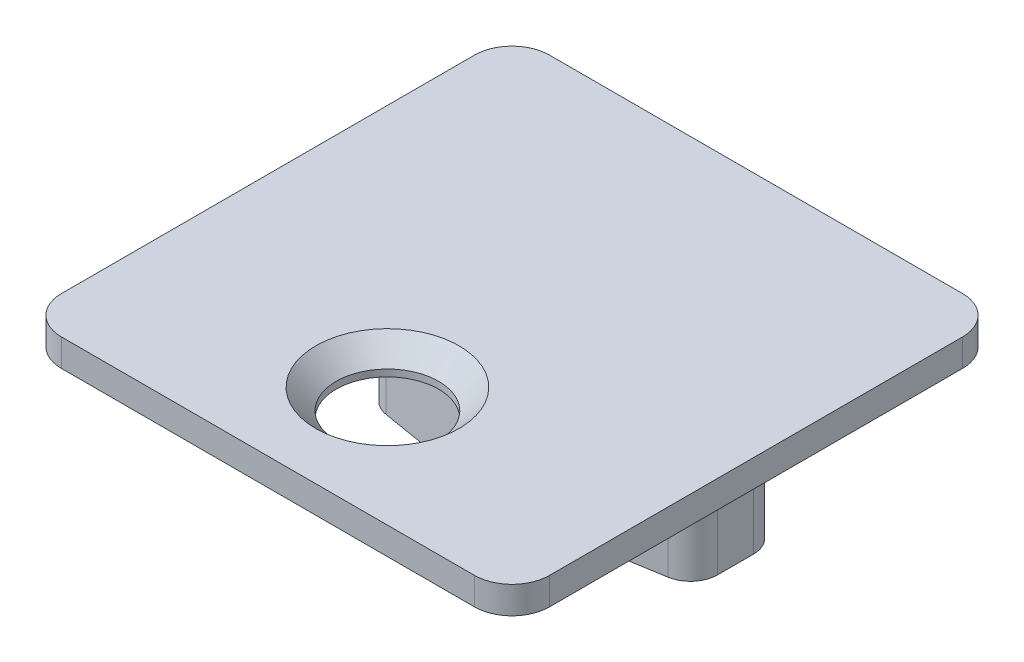
ISO-10303-21;
HEADER;
FILE_DESCRIPTION(('STEP AP214'),'2;1');
FILE_NAME('part.step','',(''),(''),'','','');
FILE_SCHEMA(('AUTOMOTIVE_DESIGN { 1 0 10303 214 1 1 1 1 }'));
ENDSEC;
DATA;
#1=APPLICATION_CONTEXT('core data for automotive mechanical design processes');
#2=APPLICATION_PROTOCOL_DEFINITION('international standard','automotive_design',2000,#1);
#3=PRODUCT_CONTEXT('',#1,'mechanical');
#4=PRODUCT('Part','Part','',(#3));
#5=PRODUCT_RELATED_PRODUCT_CATEGORY('part','',(#4));
#6=PRODUCT_DEFINITION_FORMATION('','',#4);
#7=PRODUCT_DEFINITION_CONTEXT('part definition',#1,'design');
#8=PRODUCT_DEFINITION('design','',#6,#7);
#9=PRODUCT_DEFINITION_SHAPE('','',#8);
#10=(LENGTH_UNIT() NAMED_UNIT(*) SI_UNIT(.MILLI.,.METRE.));
#11=(NAMED_UNIT(*) PLANE_ANGLE_UNIT() SI_UNIT($,.RADIAN.));
#12=(NAMED_UNIT(*) SI_UNIT($,.STERADIAN.) SOLID_ANGLE_UNIT());
#13=UNCERTAINTY_MEASURE_WITH_UNIT(LENGTH_MEASURE(1.E-05),#10,'distance_accuracy_value','');
#14=(GEOMETRIC_REPRESENTATION_CONTEXT(3) GLOBAL_UNCERTAINTY_ASSIGNED_CONTEXT((#13)) GLOBAL_UNIT_ASSIGNED_CONTEXT((#10,
#11,#12)) REPRESENTATION_CONTEXT('',''));
#15=CARTESIAN_POINT('',(0.,0.,0.));
#16=DIRECTION('',(0.,0.,1.));
#17=DIRECTION('',(1.,0.,0.));
#18=AXIS2_PLACEMENT_3D('',#15,#16,#17);
#19=CARTESIAN_POINT('',(0.,2.,-17.875));
#20=DIRECTION('',(0.,0.,-1.));
#21=DIRECTION('',(-1.,0.,0.));
#22=AXIS2_PLACEMENT_3D('',#19,#20,#21);
#23=PLANE('',#22);
#24=DIRECTION('',(1.,0.,0.));
#25=VECTOR('',#24,1.);
#26=CARTESIAN_POINT('',(0.,0.,-17.875));
#27=LINE('',#26,#25);
#28=CARTESIAN_POINT('',(-15.125,0.,-17.875));
#29=VERTEX_POINT('',#28);
#30=CARTESIAN_POINT('',(15.125,0.,-17.875));
#31=VERTEX_POINT('',#30);
#32=EDGE_CURVE('E280',#29,#31,#27,.T.);
#33=ORIENTED_EDGE('',*,*,#32,.F.);
#34=DIRECTION('',(0.,-1.,0.));
#35=VECTOR('',#34,1.);
#36=CARTESIAN_POINT('',(-15.125,2.,-17.875));
#37=LINE('',#36,#35);
#38=CARTESIAN_POINT('',(-15.125,2.,-17.875));
#39=VERTEX_POINT('',#38);
#40=EDGE_CURVE('E348',#39,#29,#37,.T.);
#41=ORIENTED_EDGE('',*,*,#40,.F.);
#42=DIRECTION('',(1.,0.,0.));
#43=VECTOR('',#42,1.);
#44=CARTESIAN_POINT('',(0.,2.,-17.875));
#45=LINE('',#44,#43);
#46=CARTESIAN_POINT('',(15.125,2.,-17.875));
#47=VERTEX_POINT('',#46);
#48=EDGE_CURVE('E289',#39,#47,#45,.T.);
#49=ORIENTED_EDGE('',*,*,#48,.T.);
#50=DIRECTION('',(0.,-1.,0.));
#51=VECTOR('',#50,1.);
#52=CARTESIAN_POINT('',(15.125,2.,-17.875));
#53=LINE('',#52,#51);
#54=EDGE_CURVE('E309',#47,#31,#53,.T.);
#55=ORIENTED_EDGE('',*,*,#54,.T.);
#56=EDGE_LOOP('',(#33,#41,#49,#55));
#57=FACE_BOUND('',#56,.T.);
#58=ADVANCED_FACE('F35',(#57),#23,.T.);
#59=CARTESIAN_POINT('',(-15.125,2.,-15.125));
#60=DIRECTION('',(0.,-1.,0.));
#61=DIRECTION('',(0.,0.,-1.));
#62=AXIS2_PLACEMENT_3D('',#59,#60,#61);
#63=CYLINDRICAL_SURFACE('',#62,2.75);
#64=CARTESIAN_POINT('',(-15.125,0.,-15.125));
#65=DIRECTION('',(0.,1.,0.));
#66=DIRECTION('',(0.,0.,1.));
#67=AXIS2_PLACEMENT_3D('',#64,#65,#66);
#68=CIRCLE('',#67,2.75);
#69=CARTESIAN_POINT('',(-17.875,0.,-15.125));
#70=VERTEX_POINT('',#69);
#71=EDGE_CURVE('E312',#29,#70,#68,.T.);
#72=ORIENTED_EDGE('',*,*,#71,.T.);
#73=DIRECTION('',(0.,-1.,0.));
#74=VECTOR('',#73,1.);
#75=CARTESIAN_POINT('',(-17.875,2.,-15.125));
#76=LINE('',#75,#74);
#77=CARTESIAN_POINT('',(-17.875,2.,-15.125));
#78=VERTEX_POINT('',#77);
#79=EDGE_CURVE('E345',#78,#70,#76,.T.);
#80=ORIENTED_EDGE('',*,*,#79,.F.);
#81=CARTESIAN_POINT('',(-15.125,2.,-15.125));
#82=DIRECTION('',(0.,1.,0.));
#83=DIRECTION('',(0.,0.,1.));
#84=AXIS2_PLACEMENT_3D('',#81,#82,#83);
#85=CIRCLE('',#84,2.75);
#86=EDGE_CURVE('E292',#39,#78,#85,.T.);
#87=ORIENTED_EDGE('',*,*,#86,.F.);
#88=ORIENTED_EDGE('',*,*,#40,.T.);
#89=EDGE_LOOP('',(#72,#80,#87,#88));
#90=FACE_BOUND('',#89,.T.);
#91=ADVANCED_FACE('F416',(#90),#63,.T.);
#92=CARTESIAN_POINT('',(-17.875,2.,0.));
#93=DIRECTION('',(1.,0.,0.));
#94=DIRECTION('',(0.,0.,-1.));
#95=AXIS2_PLACEMENT_3D('',#92,#93,#94);
#96=PLANE('',#95);
#97=DIRECTION('',(0.,0.,1.));
#98=VECTOR('',#97,1.);
#99=CARTESIAN_POINT('',(-17.875,0.,0.));
#100=LINE('',#99,#98);
#101=CARTESIAN_POINT('',(-17.875,0.,15.125));
#102=VERTEX_POINT('',#101);
#103=EDGE_CURVE('E314',#70,#102,#100,.T.);
#104=ORIENTED_EDGE('',*,*,#103,.T.);
#105=DIRECTION('',(0.,-1.,0.));
#106=VECTOR('',#105,1.);
#107=CARTESIAN_POINT('',(-17.875,2.,15.125));
#108=LINE('',#107,#106);
#109=CARTESIAN_POINT('',(-17.875,2.,15.125));
#110=VERTEX_POINT('',#109);
#111=EDGE_CURVE('E342',#110,#102,#108,.T.);
#112=ORIENTED_EDGE('',*,*,#111,.F.);
#113=DIRECTION('',(0.,0.,1.));
#114=VECTOR('',#113,1.);
#115=CARTESIAN_POINT('',(-17.875,2.,0.));
#116=LINE('',#115,#114);
#117=EDGE_CURVE('E295',#78,#110,#116,.T.);
#118=ORIENTED_EDGE('',*,*,#117,.F.);
#119=ORIENTED_EDGE('',*,*,#79,.T.);
#120=EDGE_LOOP('',(#104,#112,#118,#119));
#121=FACE_BOUND('',#120,.T.);
#122=ADVANCED_FACE('F422',(#121),#96,.F.);
#123=CARTESIAN_POINT('',(-15.125,2.,15.125));
#124=DIRECTION('',(0.,-1.,0.));
#125=DIRECTION('',(0.,0.,-1.));
#126=AXIS2_PLACEMENT_3D('',#123,#124,#125);
#127=CYLINDRICAL_SURFACE('',#126,2.75);
#128=CARTESIAN_POINT('',(-15.125,0.,15.125));
#129=DIRECTION('',(0.,1.,0.));
#130=DIRECTION('',(0.,0.,1.));
#131=AXIS2_PLACEMENT_3D('',#128,#129,#130);
#132=CIRCLE('',#131,2.75);
#133=CARTESIAN_POINT('',(-15.125,0.,17.875));
#134=VERTEX_POINT('',#133);
#135=EDGE_CURVE('E316',#102,#134,#132,.T.);
#136=ORIENTED_EDGE('',*,*,#135,.T.);
#137=DIRECTION('',(0.,-1.,0.));
#138=VECTOR('',#137,1.);
#139=CARTESIAN_POINT('',(-15.125,2.,17.875));
#140=LINE('',#139,#138);
#141=CARTESIAN_POINT('',(-15.125,2.,17.875));
#142=VERTEX_POINT('',#141);
#143=EDGE_CURVE('E339',#142,#134,#140,.T.);
#144=ORIENTED_EDGE('',*,*,#143,.F.);
#145=CARTESIAN_POINT('',(-15.125,2.,15.125));
#146=DIRECTION('',(0.,1.,0.));
#147=DIRECTION('',(0.,0.,1.));
#148=AXIS2_PLACEMENT_3D('',#145,#146,#147);
#149=CIRCLE('',#148,2.75);
#150=EDGE_CURVE('E297',#110,#142,#149,.T.);
#151=ORIENTED_EDGE('',*,*,#150,.F.);
#152=ORIENTED_EDGE('',*,*,#111,.T.);
#153=EDGE_LOOP('',(#136,#144,#151,#152));
#154=FACE_BOUND('',#153,.T.);
#155=ADVANCED_FACE('F544',(#154),#127,.T.);
#156=CARTESIAN_POINT('',(0.,2.,17.875));
#157=DIRECTION('',(0.,0.,-1.));
#158=DIRECTION('',(-1.,0.,0.));
#159=AXIS2_PLACEMENT_3D('',#156,#157,#158);
#160=PLANE('',#159);
#161=DIRECTION('',(1.,0.,0.));
#162=VECTOR('',#161,1.);
#163=CARTESIAN_POINT('',(0.,0.,17.875));
#164=LINE('',#163,#162);
#165=CARTESIAN_POINT('',(15.125,0.,17.875));
#166=VERTEX_POINT('',#165);
#167=EDGE_CURVE('E318',#134,#166,#164,.T.);
#168=ORIENTED_EDGE('',*,*,#167,.T.);
#169=DIRECTION('',(0.,-1.,0.));
#170=VECTOR('',#169,1.);
#171=CARTESIAN_POINT('',(15.125,2.,17.875));
#172=LINE('',#171,#170);
#173=CARTESIAN_POINT('',(15.125,2.,17.875));
#174=VERTEX_POINT('',#173);
#175=EDGE_CURVE('E336',#174,#166,#172,.T.);
#176=ORIENTED_EDGE('',*,*,#175,.F.);
#177=DIRECTION('',(1.,0.,0.));
#178=VECTOR('',#177,1.);
#179=CARTESIAN_POINT('',(0.,2.,17.875));
#180=LINE('',#179,#178);
#181=EDGE_CURVE('E299',#142,#174,#180,.T.);
#182=ORIENTED_EDGE('',*,*,#181,.F.);
#183=ORIENTED_EDGE('',*,*,#143,.T.);
#184=EDGE_LOOP('',(#168,#176,#182,#183));
#185=FACE_BOUND('',#184,.T.);
#186=ADVANCED_FACE('F540',(#185),#160,.F.);
#187=CARTESIAN_POINT('',(15.125,2.,15.125));
#188=DIRECTION('',(0.,-1.,0.));
#189=DIRECTION('',(0.,0.,-1.));
#190=AXIS2_PLACEMENT_3D('',#187,#188,#189);
#191=CYLINDRICAL_SURFACE('',#190,2.75);
#192=CARTESIAN_POINT('',(15.125,0.,15.125));
#193=DIRECTION('',(0.,1.,0.));
#194=DIRECTION('',(0.,0.,1.));
#195=AXIS2_PLACEMENT_3D('',#192,#193,#194);
#196=CIRCLE('',#195,2.75);
#197=CARTESIAN_POINT('',(17.875,0.,15.125));
#198=VERTEX_POINT('',#197);
#199=EDGE_CURVE('E320',#166,#198,#196,.T.);
#200=ORIENTED_EDGE('',*,*,#199,.T.);
#201=DIRECTION('',(0.,-1.,0.));
#202=VECTOR('',#201,1.);
#203=CARTESIAN_POINT('',(17.875,2.,15.125));
#204=LINE('',#203,#202);
#205=CARTESIAN_POINT('',(17.875,2.,15.125));
#206=VERTEX_POINT('',#205);
#207=EDGE_CURVE('E334',#206,#198,#204,.T.);
#208=ORIENTED_EDGE('',*,*,#207,.F.);
#209=CARTESIAN_POINT('',(15.125,2.,15.125));
#210=DIRECTION('',(0.,1.,0.));
#211=DIRECTION('',(0.,0.,1.));
#212=AXIS2_PLACEMENT_3D('',#209,#210,#211);
#213=CIRCLE('',#212,2.75);
#214=EDGE_CURVE('E301',#174,#206,#213,.T.);
#215=ORIENTED_EDGE('',*,*,#214,.F.);
#216=ORIENTED_EDGE('',*,*,#175,.T.);
#217=EDGE_LOOP('',(#200,#208,#215,#216));
#218=FACE_BOUND('',#217,.T.);
#219=ADVANCED_FACE('F536',(#218),#191,.T.);
#220=CARTESIAN_POINT('',(17.875,2.,0.));
#221=DIRECTION('',(1.,0.,0.));
#222=DIRECTION('',(0.,0.,-1.));
#223=AXIS2_PLACEMENT_3D('',#220,#221,#222);
#224=PLANE('',#223);
#225=DIRECTION('',(0.,0.,1.));
#226=VECTOR('',#225,1.);
#227=CARTESIAN_POINT('',(17.875,0.,0.));
#228=LINE('',#227,#226);
#229=CARTESIAN_POINT('',(17.875,0.,-15.125));
#230=VERTEX_POINT('',#229);
#231=EDGE_CURVE('E323',#230,#198,#228,.T.);
#232=ORIENTED_EDGE('',*,*,#231,.F.);
#233=DIRECTION('',(0.,-1.,0.));
#234=VECTOR('',#233,1.);
#235=CARTESIAN_POINT('',(17.875,2.,-15.125));
#236=LINE('',#235,#234);
#237=CARTESIAN_POINT('',(17.875,2.,-15.125));
#238=VERTEX_POINT('',#237);
#239=EDGE_CURVE('E332',#238,#230,#236,.T.);
#240=ORIENTED_EDGE('',*,*,#239,.F.);
#241=DIRECTION('',(0.,0.,1.));
#242=VECTOR('',#241,1.);
#243=CARTESIAN_POINT('',(17.875,2.,0.));
#244=LINE('',#243,#242);
#245=EDGE_CURVE('E303',#238,#206,#244,.T.);
#246=ORIENTED_EDGE('',*,*,#245,.T.);
#247=ORIENTED_EDGE('',*,*,#207,.T.);
#248=EDGE_LOOP('',(#232,#240,#246,#247));
#249=FACE_BOUND('',#248,.T.);
#250=ADVANCED_FACE('F532',(#249),#224,.T.);
#251=CARTESIAN_POINT('',(15.125,2.,-15.125));
#252=DIRECTION('',(0.,-1.,0.));
#253=DIRECTION('',(0.,0.,-1.));
#254=AXIS2_PLACEMENT_3D('',#251,#252,#253);
#255=CYLINDRICAL_SURFACE('',#254,2.75);
#256=CARTESIAN_POINT('',(15.125,0.,-15.125));
#257=DIRECTION('',(0.,1.,0.));
#258=DIRECTION('',(0.,0.,1.));
#259=AXIS2_PLACEMENT_3D('',#256,#257,#258);
#260=CIRCLE('',#259,2.75);
#261=EDGE_CURVE('E326',#31,#230,#260,.F.);
#262=ORIENTED_EDGE('',*,*,#261,.F.);
#263=ORIENTED_EDGE('',*,*,#54,.F.);
#264=CARTESIAN_POINT('',(15.125,2.,-15.125));
#265=DIRECTION('',(0.,1.,0.));
#266=DIRECTION('',(0.,0.,1.));
#267=AXIS2_PLACEMENT_3D('',#264,#265,#266);
#268=CIRCLE('',#267,2.75);
#269=EDGE_CURVE('E306',#47,#238,#268,.F.);
#270=ORIENTED_EDGE('',*,*,#269,.T.);
#271=ORIENTED_EDGE('',*,*,#239,.T.);
#272=EDGE_LOOP('',(#262,#263,#270,#271));
#273=FACE_BOUND('',#272,.T.);
#274=ADVANCED_FACE('F529',(#273),#255,.T.);
#275=CARTESIAN_POINT('',(0.,2.,9.125));
#276=DIRECTION('',(0.,-1.,0.));
#277=DIRECTION('',(0.,0.,-1.));
#278=AXIS2_PLACEMENT_3D('',#275,#276,#277);
#279=CYLINDRICAL_SURFACE('',#278,3.75);
#280=CARTESIAN_POINT('',(0.,0.499999999999996,9.125));
#281=DIRECTION('',(0.,1.,0.));
#282=DIRECTION('',(0.,0.,1.));
#283=AXIS2_PLACEMENT_3D('',#280,#281,#282);
#284=CIRCLE('',#283,3.75);
#285=CARTESIAN_POINT('',(0.,0.499999999999996,12.875));
#286=VERTEX_POINT('',#285);
#287=EDGE_CURVE('E43',#286,#286,#284,.T.);
#288=ORIENTED_EDGE('',*,*,#287,.T.);
#289=EDGE_LOOP('',(#288));
#290=FACE_BOUND('',#289,.T.);
#291=CARTESIAN_POINT('',(0.,0.,9.125));
#292=DIRECTION('',(0.,1.,0.));
#293=DIRECTION('',(0.,0.,1.));
#294=AXIS2_PLACEMENT_3D('',#291,#292,#293);
#295=CIRCLE('',#294,3.75);
#296=CARTESIAN_POINT('',(0.,0.,12.875));
#297=VERTEX_POINT('',#296);
#298=EDGE_CURVE('E293',#297,#297,#295,.T.);
#299=ORIENTED_EDGE('',*,*,#298,.F.);
#300=EDGE_LOOP('',(#299));
#301=FACE_BOUND('',#300,.T.);
#302=ADVANCED_FACE('F403',(#290,#301),#279,.F.);
#303=CARTESIAN_POINT('',(0.,2.,0.));
#304=DIRECTION('',(0.,1.,0.));
#305=DIRECTION('',(0.,0.,1.));
#306=AXIS2_PLACEMENT_3D('',#303,#304,#305);
#307=PLANE('',#306);
#308=CARTESIAN_POINT('',(0.,2.,9.125));
#309=DIRECTION('',(0.,1.,0.));
#310=DIRECTION('',(0.,0.,1.));
#311=AXIS2_PLACEMENT_3D('',#308,#309,#310);
#312=CIRCLE('',#311,5.25);
#313=CARTESIAN_POINT('',(0.,2.,14.375));
#314=VERTEX_POINT('',#313);
#315=EDGE_CURVE('E11',#314,#314,#312,.F.);
#316=ORIENTED_EDGE('',*,*,#315,.T.);
#317=EDGE_LOOP('',(#316));
#318=FACE_BOUND('',#317,.T.);
#319=ORIENTED_EDGE('',*,*,#48,.F.);
#320=ORIENTED_EDGE('',*,*,#86,.T.);
#321=ORIENTED_EDGE('',*,*,#117,.T.);
#322=ORIENTED_EDGE('',*,*,#150,.T.);
#323=ORIENTED_EDGE('',*,*,#181,.T.);
#324=ORIENTED_EDGE('',*,*,#214,.T.);
#325=ORIENTED_EDGE('',*,*,#245,.F.);
#326=ORIENTED_EDGE('',*,*,#269,.F.);
#327=EDGE_LOOP('',(#319,#320,#321,#322,#323,#324,#325,#326));
#328=FACE_BOUND('',#327,.T.);
#329=ADVANCED_FACE('F521',(#318,#328),#307,.T.);
#330=CARTESIAN_POINT('',(0.,0.,0.));
#331=DIRECTION('',(0.,1.,0.));
#332=DIRECTION('',(0.,0.,1.));
#333=AXIS2_PLACEMENT_3D('',#330,#331,#332);
#334=PLANE('',#333);
#335=DIRECTION('',(0.986393923832144,0.,-0.164398987305357));
#336=VECTOR('',#335,1.);
#337=CARTESIAN_POINT('',(-1.52027027027027,0.,-9.12162162162162));
#338=LINE('',#337,#336);
#339=CARTESIAN_POINT('',(-10.3287979746107,0.,-7.65353367089822));
#340=VERTEX_POINT('',#339);
#341=CARTESIAN_POINT('',(-0.328797974610716,0.,-9.32020033756488));
#342=VERTEX_POINT('',#341);
#343=EDGE_CURVE('E259',#340,#342,#338,.T.);
#344=ORIENTED_EDGE('',*,*,#343,.F.);
#345=CARTESIAN_POINT('',(-10.,0.,-5.68074582323393));
#346=DIRECTION('',(0.,1.,0.));
#347=DIRECTION('',(0.,0.,1.));
#348=AXIS2_PLACEMENT_3D('',#345,#346,#347);
#349=CIRCLE('',#348,2.);
#350=CARTESIAN_POINT('',(-12.,0.,-5.68074582323393));
#351=VERTEX_POINT('',#350);
#352=EDGE_CURVE('E58',#340,#351,#349,.T.);
#353=ORIENTED_EDGE('',*,*,#352,.T.);
#354=DIRECTION('',(0.,0.,1.));
#355=VECTOR('',#354,1.);
#356=CARTESIAN_POINT('',(-12.,0.,0.));
#357=LINE('',#356,#355);
#358=CARTESIAN_POINT('',(-12.,0.,-3.06925417676608));
#359=VERTEX_POINT('',#358);
#360=EDGE_CURVE('E262',#351,#359,#357,.T.);
#361=ORIENTED_EDGE('',*,*,#360,.T.);
#362=CARTESIAN_POINT('',(-10.,0.,-3.06925417676608));
#363=DIRECTION('',(0.,1.,0.));
#364=DIRECTION('',(0.,0.,1.));
#365=AXIS2_PLACEMENT_3D('',#362,#363,#364);
#366=CIRCLE('',#365,2.);
#367=CARTESIAN_POINT('',(-10.3287979746107,0.,-1.09646632910179));
#368=VERTEX_POINT('',#367);
#369=EDGE_CURVE('E50',#359,#368,#366,.T.);
#370=ORIENTED_EDGE('',*,*,#369,.T.);
#371=DIRECTION('',(0.986393923832144,0.,0.164398987305357));
#372=VECTOR('',#371,1.);
#373=CARTESIAN_POINT('',(-0.101351351351351,0.,0.608108108108103));
#374=LINE('',#373,#372);
#375=CARTESIAN_POINT('',(-0.328797974610712,0.,0.570200337564876));
#376=VERTEX_POINT('',#375);
#377=EDGE_CURVE('E247',#368,#376,#374,.T.);
#378=ORIENTED_EDGE('',*,*,#377,.T.);
#379=CARTESIAN_POINT('',(0.,0.,-1.40258751009941));
#380=DIRECTION('',(0.,1.,0.));
#381=DIRECTION('',(0.,0.,1.));
#382=AXIS2_PLACEMENT_3D('',#379,#380,#381);
#383=CIRCLE('',#382,2.);
#384=CARTESIAN_POINT('',(0.328797974610717,0.,0.570200337564876));
#385=VERTEX_POINT('',#384);
#386=EDGE_CURVE('E393',#376,#385,#383,.T.);
#387=ORIENTED_EDGE('',*,*,#386,.T.);
#388=DIRECTION('',(0.986393923832144,0.,-0.164398987305357));
#389=VECTOR('',#388,1.);
#390=CARTESIAN_POINT('',(0.101351351351351,0.,0.608108108108104));
#391=LINE('',#390,#389);
#392=CARTESIAN_POINT('',(10.3287979746107,0.,-1.09646632910179));
#393=VERTEX_POINT('',#392);
#394=EDGE_CURVE('E250',#385,#393,#391,.T.);
#395=ORIENTED_EDGE('',*,*,#394,.T.);
#396=CARTESIAN_POINT('',(10.,0.,-3.06925417676608));
#397=DIRECTION('',(0.,1.,0.));
#398=DIRECTION('',(0.,0.,1.));
#399=AXIS2_PLACEMENT_3D('',#396,#397,#398);
#400=CIRCLE('',#399,2.);
#401=CARTESIAN_POINT('',(12.,0.,-3.06925417676608));
#402=VERTEX_POINT('',#401);
#403=EDGE_CURVE('E395',#393,#402,#400,.T.);
#404=ORIENTED_EDGE('',*,*,#403,.T.);
#405=DIRECTION('',(0.,0.,1.));
#406=VECTOR('',#405,1.);
#407=CARTESIAN_POINT('',(12.,0.,0.));
#408=LINE('',#407,#406);
#409=CARTESIAN_POINT('',(12.,0.,-5.68074582323393));
#410=VERTEX_POINT('',#409);
#411=EDGE_CURVE('E253',#410,#402,#408,.T.);
#412=ORIENTED_EDGE('',*,*,#411,.F.);
#413=CARTESIAN_POINT('',(10.,0.,-5.68074582323393));
#414=DIRECTION('',(0.,1.,0.));
#415=DIRECTION('',(0.,0.,1.));
#416=AXIS2_PLACEMENT_3D('',#413,#414,#415);
#417=CIRCLE('',#416,2.);
#418=CARTESIAN_POINT('',(10.3287979746107,0.,-7.65353367089822));
#419=VERTEX_POINT('',#418);
#420=EDGE_CURVE('E397',#410,#419,#417,.T.);
#421=ORIENTED_EDGE('',*,*,#420,.T.);
#422=DIRECTION('',(0.986393923832144,0.,0.164398987305357));
#423=VECTOR('',#422,1.);
#424=CARTESIAN_POINT('',(1.52027027027027,0.,-9.12162162162162));
#425=LINE('',#424,#423);
#426=CARTESIAN_POINT('',(0.328797974610712,0.,-9.32020033756488));
#427=VERTEX_POINT('',#426);
#428=EDGE_CURVE('E256',#427,#419,#425,.T.);
#429=ORIENTED_EDGE('',*,*,#428,.F.);
#430=CARTESIAN_POINT('',(0.,0.,-7.3474124899006));
#431=DIRECTION('',(0.,1.,0.));
#432=DIRECTION('',(0.,0.,1.));
#433=AXIS2_PLACEMENT_3D('',#430,#431,#432);
#434=CIRCLE('',#433,2.);
#435=EDGE_CURVE('E391',#427,#342,#434,.T.);
#436=ORIENTED_EDGE('',*,*,#435,.T.);
#437=EDGE_LOOP('',(#344,#353,#361,#370,#378,#387,#395,#404,#412,#421,#429,#436));
#438=FACE_BOUND('',#437,.T.);
#439=ORIENTED_EDGE('',*,*,#32,.T.);
#440=ORIENTED_EDGE('',*,*,#261,.T.);
#441=ORIENTED_EDGE('',*,*,#231,.T.);
#442=ORIENTED_EDGE('',*,*,#199,.F.);
#443=ORIENTED_EDGE('',*,*,#167,.F.);
#444=ORIENTED_EDGE('',*,*,#135,.F.);
#445=ORIENTED_EDGE('',*,*,#103,.F.);
#446=ORIENTED_EDGE('',*,*,#71,.F.);
#447=EDGE_LOOP('',(#439,#440,#441,#442,#443,#444,#445,#446));
#448=FACE_BOUND('',#447,.T.);
#449=ORIENTED_EDGE('',*,*,#298,.T.);
#450=EDGE_LOOP('',(#449));
#451=FACE_BOUND('',#450,.T.);
#452=ADVANCED_FACE('F478',(#438,#448,#451),#334,.F.);
#453=CARTESIAN_POINT('',(-10.5,-10.,0.));
#454=DIRECTION('',(-1.,0.,0.));
#455=DIRECTION('',(0.,0.,1.));
#456=AXIS2_PLACEMENT_3D('',#453,#454,#455);
#457=PLANE('',#456);
#458=DIRECTION('',(0.,0.,1.));
#459=VECTOR('',#458,1.);
#460=CARTESIAN_POINT('',(-10.5,0.,0.));
#461=LINE('',#460,#459);
#462=CARTESIAN_POINT('',(-10.5,0.,-6.10430936742545));
#463=VERTEX_POINT('',#462);
#464=CARTESIAN_POINT('',(-10.5,0.,-2.64569063257456));
#465=VERTEX_POINT('',#464);
#466=EDGE_CURVE('E264',#463,#465,#461,.T.);
#467=ORIENTED_EDGE('',*,*,#466,.T.);
#468=DIRECTION('',(0.,1.,0.));
#469=VECTOR('',#468,1.);
#470=CARTESIAN_POINT('',(-10.5,-10.,-2.64569063257456));
#471=LINE('',#470,#469);
#472=CARTESIAN_POINT('',(-10.5,-10.,-2.64569063257456));
#473=VERTEX_POINT('',#472);
#474=EDGE_CURVE('E228',#473,#465,#471,.T.);
#475=ORIENTED_EDGE('',*,*,#474,.F.);
#476=DIRECTION('',(0.,0.,1.));
#477=VECTOR('',#476,1.);
#478=CARTESIAN_POINT('',(-10.5,-10.,0.));
#479=LINE('',#478,#477);
#480=CARTESIAN_POINT('',(-10.5,-10.,-6.10430936742545));
#481=VERTEX_POINT('',#480);
#482=EDGE_CURVE('E226',#481,#473,#479,.T.);
#483=ORIENTED_EDGE('',*,*,#482,.F.);
#484=DIRECTION('',(0.,1.,0.));
#485=VECTOR('',#484,1.);
#486=CARTESIAN_POINT('',(-10.5,-10.,-6.10430936742545));
#487=LINE('',#486,#485);
#488=EDGE_CURVE('E210',#481,#463,#487,.T.);
#489=ORIENTED_EDGE('',*,*,#488,.T.);
#490=EDGE_LOOP('',(#467,#475,#483,#489));
#491=FACE_BOUND('',#490,.T.);
#492=ADVANCED_FACE('F227',(#491),#457,.F.);
#493=CARTESIAN_POINT('',(0.145247129606686,-10.,-0.871482777640114));
#494=DIRECTION('',(-0.164398987305357,0.,0.986393923832144));
#495=DIRECTION('',(0.986393923832144,0.,0.164398987305357));
#496=AXIS2_PLACEMENT_3D('',#493,#494,#495);
#497=PLANE('',#496);
#498=DIRECTION('',(0.986393923832144,0.,0.164398987305357));
#499=VECTOR('',#498,1.);
#500=CARTESIAN_POINT('',(0.145247129606686,0.,-0.871482777640114));
#501=LINE('',#500,#499);
#502=CARTESIAN_POINT('',(0.,0.,-0.89569063257456));
#503=VERTEX_POINT('',#502);
#504=EDGE_CURVE('E276',#465,#503,#501,.T.);
#505=ORIENTED_EDGE('',*,*,#504,.T.);
#506=DIRECTION('',(0.,1.,0.));
#507=VECTOR('',#506,1.);
#508=CARTESIAN_POINT('',(0.,-10.,-0.89569063257456));
#509=LINE('',#508,#507);
#510=CARTESIAN_POINT('',(0.,-10.,-0.89569063257456));
#511=VERTEX_POINT('',#510);
#512=EDGE_CURVE('E281',#511,#503,#509,.T.);
#513=ORIENTED_EDGE('',*,*,#512,.F.);
#514=DIRECTION('',(0.986393923832144,0.,0.164398987305357));
#515=VECTOR('',#514,1.);
#516=CARTESIAN_POINT('',(0.145247129606686,-10.,-0.871482777640114));
#517=LINE('',#516,#515);
#518=EDGE_CURVE('E222',#473,#511,#517,.T.);
#519=ORIENTED_EDGE('',*,*,#518,.F.);
#520=ORIENTED_EDGE('',*,*,#474,.T.);
#521=EDGE_LOOP('',(#505,#513,#519,#520));
#522=FACE_BOUND('',#521,.T.);
#523=ADVANCED_FACE('F618',(#522),#497,.F.);
#524=CARTESIAN_POINT('',(-0.145247129606685,-10.,-0.871482777640112));
#525=DIRECTION('',(0.164398987305357,0.,0.986393923832144));
#526=DIRECTION('',(0.986393923832144,0.,-0.164398987305357));
#527=AXIS2_PLACEMENT_3D('',#524,#525,#526);
#528=PLANE('',#527);
#529=DIRECTION('',(0.986393923832144,0.,-0.164398987305357));
#530=VECTOR('',#529,1.);
#531=CARTESIAN_POINT('',(-0.145247129606685,0.,-0.871482777640112));
#532=LINE('',#531,#530);
#533=CARTESIAN_POINT('',(10.5,0.,-2.64569063257456));
#534=VERTEX_POINT('',#533);
#535=EDGE_CURVE('E273',#503,#534,#532,.T.);
#536=ORIENTED_EDGE('',*,*,#535,.T.);
#537=DIRECTION('',(0.,1.,0.));
#538=VECTOR('',#537,1.);
#539=CARTESIAN_POINT('',(10.5,-10.,-2.64569063257456));
#540=LINE('',#539,#538);
#541=CARTESIAN_POINT('',(10.5,-10.,-2.64569063257456));
#542=VERTEX_POINT('',#541);
#543=EDGE_CURVE('E284',#542,#534,#540,.T.);
#544=ORIENTED_EDGE('',*,*,#543,.F.);
#545=DIRECTION('',(0.986393923832144,0.,-0.164398987305357));
#546=VECTOR('',#545,1.);
#547=CARTESIAN_POINT('',(-0.145247129606685,-10.,-0.871482777640112));
#548=LINE('',#547,#546);
#549=EDGE_CURVE('E244',#511,#542,#548,.T.);
#550=ORIENTED_EDGE('',*,*,#549,.F.);
#551=ORIENTED_EDGE('',*,*,#512,.T.);
#552=EDGE_LOOP('',(#536,#544,#550,#551));
#553=FACE_BOUND('',#552,.T.);
#554=ADVANCED_FACE('F624',(#553),#528,.F.);
#555=CARTESIAN_POINT('',(10.5,-10.,0.));
#556=DIRECTION('',(-1.,0.,0.));
#557=DIRECTION('',(0.,0.,1.));
#558=AXIS2_PLACEMENT_3D('',#555,#556,#557);
#559=PLANE('',#558);
#560=DIRECTION('',(0.,0.,1.));
#561=VECTOR('',#560,1.);
#562=CARTESIAN_POINT('',(10.5,0.,0.));
#563=LINE('',#562,#561);
#564=CARTESIAN_POINT('',(10.5,0.,-6.10430936742545));
#565=VERTEX_POINT('',#564);
#566=EDGE_CURVE('E270',#565,#534,#563,.T.);
#567=ORIENTED_EDGE('',*,*,#566,.F.);
#568=DIRECTION('',(0.,1.,0.));
#569=VECTOR('',#568,1.);
#570=CARTESIAN_POINT('',(10.5,-10.,-6.10430936742545));
#571=LINE('',#570,#569);
#572=CARTESIAN_POINT('',(10.5,-10.,-6.10430936742545));
#573=VERTEX_POINT('',#572);
#574=EDGE_CURVE('E286',#573,#565,#571,.T.);
#575=ORIENTED_EDGE('',*,*,#574,.F.);
#576=DIRECTION('',(0.,0.,1.));
#577=VECTOR('',#576,1.);
#578=CARTESIAN_POINT('',(10.5,-10.,0.));
#579=LINE('',#578,#577);
#580=EDGE_CURVE('E238',#573,#542,#579,.T.);
#581=ORIENTED_EDGE('',*,*,#580,.T.);
#582=ORIENTED_EDGE('',*,*,#543,.T.);
#583=EDGE_LOOP('',(#567,#575,#581,#582));
#584=FACE_BOUND('',#583,.T.);
#585=ADVANCED_FACE('F632',(#584),#559,.T.);
#586=CARTESIAN_POINT('',(1.27367178931223,-10.,-7.64203073587341));
#587=DIRECTION('',(-0.164398987305357,0.,0.986393923832144));
#588=DIRECTION('',(0.986393923832144,0.,0.164398987305357));
#589=AXIS2_PLACEMENT_3D('',#586,#587,#588);
#590=PLANE('',#589);
#591=DIRECTION('',(0.986393923832144,0.,0.164398987305357));
#592=VECTOR('',#591,1.);
#593=CARTESIAN_POINT('',(1.27367178931223,0.,-7.64203073587341));
#594=LINE('',#593,#592);
#595=CARTESIAN_POINT('',(0.,0.,-7.85430936742545));
#596=VERTEX_POINT('',#595);
#597=EDGE_CURVE('E267',#596,#565,#594,.T.);
#598=ORIENTED_EDGE('',*,*,#597,.F.);
#599=DIRECTION('',(0.,1.,0.));
#600=VECTOR('',#599,1.);
#601=CARTESIAN_POINT('',(0.,-10.,-7.85430936742544));
#602=LINE('',#601,#600);
#603=CARTESIAN_POINT('',(0.,-10.,-7.85430936742544));
#604=VERTEX_POINT('',#603);
#605=EDGE_CURVE('E221',#604,#596,#602,.T.);
#606=ORIENTED_EDGE('',*,*,#605,.F.);
#607=DIRECTION('',(0.986393923832144,0.,0.164398987305357));
#608=VECTOR('',#607,1.);
#609=CARTESIAN_POINT('',(1.27367178931223,-10.,-7.64203073587341));
#610=LINE('',#609,#608);
#611=EDGE_CURVE('E236',#604,#573,#610,.T.);
#612=ORIENTED_EDGE('',*,*,#611,.T.);
#613=ORIENTED_EDGE('',*,*,#574,.T.);
#614=EDGE_LOOP('',(#598,#606,#612,#613));
#615=FACE_BOUND('',#614,.T.);
#616=ADVANCED_FACE('F520',(#615),#590,.T.);
#617=CARTESIAN_POINT('',(-0.101351351351351,-10.,0.608108108108103));
#618=DIRECTION('',(-0.164398987305357,0.,0.986393923832144));
#619=DIRECTION('',(0.986393923832144,0.,0.164398987305357));
#620=AXIS2_PLACEMENT_3D('',#617,#618,#619);
#621=PLANE('',#620);
#622=DIRECTION('',(0.986393923832144,0.,0.164398987305357));
#623=VECTOR('',#622,1.);
#624=CARTESIAN_POINT('',(-0.101351351351351,-10.,0.608108108108103));
#625=LINE('',#624,#623);
#626=CARTESIAN_POINT('',(-10.3287979746107,-10.,-1.09646632910179));
#627=VERTEX_POINT('',#626);
#628=CARTESIAN_POINT('',(-0.328797974610712,-10.,0.570200337564876));
#629=VERTEX_POINT('',#628);
#630=EDGE_CURVE('E278',#627,#629,#625,.T.);
#631=ORIENTED_EDGE('',*,*,#630,.T.);
#632=DIRECTION('',(0.,1.,0.));
#633=VECTOR('',#632,1.);
#634=CARTESIAN_POINT('',(-0.328797974610712,-10.,0.570200337564876));
#635=LINE('',#634,#633);
#636=EDGE_CURVE('E374',#629,#376,#635,.T.);
#637=ORIENTED_EDGE('',*,*,#636,.T.);
#638=ORIENTED_EDGE('',*,*,#377,.F.);
#639=DIRECTION('',(0.,1.,0.));
#640=VECTOR('',#639,1.);
#641=CARTESIAN_POINT('',(-10.3287979746107,-10.,-1.09646632910179));
#642=LINE('',#641,#640);
#643=EDGE_CURVE('E372',#368,#627,#642,.F.);
#644=ORIENTED_EDGE('',*,*,#643,.T.);
#645=EDGE_LOOP('',(#631,#637,#638,#644));
#646=FACE_BOUND('',#645,.T.);
#647=ADVANCED_FACE('F473',(#646),#621,.T.);
#648=CARTESIAN_POINT('',(-12.,-10.,0.));
#649=DIRECTION('',(-1.,0.,0.));
#650=DIRECTION('',(0.,0.,1.));
#651=AXIS2_PLACEMENT_3D('',#648,#649,#650);
#652=PLANE('',#651);
#653=DIRECTION('',(0.,0.,1.));
#654=VECTOR('',#653,1.);
#655=CARTESIAN_POINT('',(-12.,-10.,0.));
#656=LINE('',#655,#654);
#657=CARTESIAN_POINT('',(-12.,-10.,-5.68074582323393));
#658=VERTEX_POINT('',#657);
#659=CARTESIAN_POINT('',(-12.,-10.,-3.06925417676608));
#660=VERTEX_POINT('',#659);
#661=EDGE_CURVE('E230',#658,#660,#656,.T.);
#662=ORIENTED_EDGE('',*,*,#661,.T.);
#663=DIRECTION('',(0.,1.,0.));
#664=VECTOR('',#663,1.);
#665=CARTESIAN_POINT('',(-12.,-10.,-3.06925417676608));
#666=LINE('',#665,#664);
#667=EDGE_CURVE('E389',#660,#359,#666,.T.);
#668=ORIENTED_EDGE('',*,*,#667,.T.);
#669=ORIENTED_EDGE('',*,*,#360,.F.);
#670=DIRECTION('',(0.,1.,0.));
#671=VECTOR('',#670,1.);
#672=CARTESIAN_POINT('',(-12.,-10.,-5.68074582323393));
#673=LINE('',#672,#671);
#674=EDGE_CURVE('E387',#351,#658,#673,.F.);
#675=ORIENTED_EDGE('',*,*,#674,.T.);
#676=EDGE_LOOP('',(#662,#668,#669,#675));
#677=FACE_BOUND('',#676,.T.);
#678=ADVANCED_FACE('F457',(#677),#652,.T.);
#679=CARTESIAN_POINT('',(-1.52027027027027,-10.,-9.12162162162162));
#680=DIRECTION('',(0.164398987305357,0.,0.986393923832144));
#681=DIRECTION('',(0.986393923832144,0.,-0.164398987305357));
#682=AXIS2_PLACEMENT_3D('',#679,#680,#681);
#683=PLANE('',#682);
#684=ORIENTED_EDGE('',*,*,#343,.T.);
#685=DIRECTION('',(0.,1.,0.));
#686=VECTOR('',#685,1.);
#687=CARTESIAN_POINT('',(-0.328797974610716,-10.,-9.32020033756488));
#688=LINE('',#687,#686);
#689=CARTESIAN_POINT('',(-0.328797974610716,-10.,-9.32020033756488));
#690=VERTEX_POINT('',#689);
#691=EDGE_CURVE('E358',#342,#690,#688,.F.);
#692=ORIENTED_EDGE('',*,*,#691,.T.);
#693=DIRECTION('',(0.986393923832144,0.,-0.164398987305357));
#694=VECTOR('',#693,1.);
#695=CARTESIAN_POINT('',(-1.52027027027027,-10.,-9.12162162162162));
#696=LINE('',#695,#694);
#697=CARTESIAN_POINT('',(-10.3287979746107,-10.,-7.65353367089822));
#698=VERTEX_POINT('',#697);
#699=EDGE_CURVE('E459',#698,#690,#696,.T.);
#700=ORIENTED_EDGE('',*,*,#699,.F.);
#701=DIRECTION('',(0.,1.,0.));
#702=VECTOR('',#701,1.);
#703=CARTESIAN_POINT('',(-10.3287979746107,0.,-7.65353367089822));
#704=LINE('',#703,#702);
#705=EDGE_CURVE('E355',#698,#340,#704,.T.);
#706=ORIENTED_EDGE('',*,*,#705,.T.);
#707=EDGE_LOOP('',(#684,#692,#700,#706));
#708=FACE_BOUND('',#707,.T.);
#709=ADVANCED_FACE('F501',(#708),#683,.F.);
#710=CARTESIAN_POINT('',(1.52027027027027,-10.,-9.12162162162162));
#711=DIRECTION('',(-0.164398987305357,0.,0.986393923832144));
#712=DIRECTION('',(0.986393923832144,0.,0.164398987305357));
#713=AXIS2_PLACEMENT_3D('',#710,#711,#712);
#714=PLANE('',#713);
#715=DIRECTION('',(0.986393923832144,0.,0.164398987305357));
#716=VECTOR('',#715,1.);
#717=CARTESIAN_POINT('',(1.52027027027027,-10.,-9.12162162162162));
#718=LINE('',#717,#716);
#719=CARTESIAN_POINT('',(0.328797974610712,-10.,-9.32020033756488));
#720=VERTEX_POINT('',#719);
#721=CARTESIAN_POINT('',(10.3287979746107,-10.,-7.65353367089822));
#722=VERTEX_POINT('',#721);
#723=EDGE_CURVE('E460',#720,#722,#718,.T.);
#724=ORIENTED_EDGE('',*,*,#723,.F.);
#725=DIRECTION('',(0.,1.,0.));
#726=VECTOR('',#725,1.);
#727=CARTESIAN_POINT('',(0.328797974610712,-10.,-9.32020033756488));
#728=LINE('',#727,#726);
#729=EDGE_CURVE('E352',#720,#427,#728,.T.);
#730=ORIENTED_EDGE('',*,*,#729,.T.);
#731=ORIENTED_EDGE('',*,*,#428,.T.);
#732=DIRECTION('',(0.,1.,0.));
#733=VECTOR('',#732,1.);
#734=CARTESIAN_POINT('',(10.3287979746107,-10.,-7.65353367089822));
#735=LINE('',#734,#733);
#736=EDGE_CURVE('E350',#419,#722,#735,.F.);
#737=ORIENTED_EDGE('',*,*,#736,.T.);
#738=EDGE_LOOP('',(#724,#730,#731,#737));
#739=FACE_BOUND('',#738,.T.);
#740=ADVANCED_FACE('F496',(#739),#714,.F.);
#741=CARTESIAN_POINT('',(12.,-10.,0.));
#742=DIRECTION('',(-1.,0.,0.));
#743=DIRECTION('',(0.,0.,1.));
#744=AXIS2_PLACEMENT_3D('',#741,#742,#743);
#745=PLANE('',#744);
#746=ORIENTED_EDGE('',*,*,#411,.T.);
#747=DIRECTION('',(0.,1.,0.));
#748=VECTOR('',#747,1.);
#749=CARTESIAN_POINT('',(12.,-10.,-3.06925417676608));
#750=LINE('',#749,#748);
#751=CARTESIAN_POINT('',(12.,-10.,-3.06925417676608));
#752=VERTEX_POINT('',#751);
#753=EDGE_CURVE('E385',#402,#752,#750,.F.);
#754=ORIENTED_EDGE('',*,*,#753,.T.);
#755=DIRECTION('',(0.,0.,1.));
#756=VECTOR('',#755,1.);
#757=CARTESIAN_POINT('',(12.,-10.,0.));
#758=LINE('',#757,#756);
#759=CARTESIAN_POINT('',(12.,-10.,-5.68074582323393));
#760=VERTEX_POINT('',#759);
#761=EDGE_CURVE('E465',#760,#752,#758,.T.);
#762=ORIENTED_EDGE('',*,*,#761,.F.);
#763=DIRECTION('',(0.,1.,0.));
#764=VECTOR('',#763,1.);
#765=CARTESIAN_POINT('',(12.,-10.,-5.68074582323393));
#766=LINE('',#765,#764);
#767=EDGE_CURVE('E382',#760,#410,#766,.T.);
#768=ORIENTED_EDGE('',*,*,#767,.T.);
#769=EDGE_LOOP('',(#746,#754,#762,#768));
#770=FACE_BOUND('',#769,.T.);
#771=ADVANCED_FACE('F488',(#770),#745,.F.);
#772=CARTESIAN_POINT('',(0.101351351351351,-10.,0.608108108108104));
#773=DIRECTION('',(0.164398987305357,0.,0.986393923832144));
#774=DIRECTION('',(0.986393923832144,0.,-0.164398987305357));
#775=AXIS2_PLACEMENT_3D('',#772,#773,#774);
#776=PLANE('',#775);
#777=ORIENTED_EDGE('',*,*,#394,.F.);
#778=DIRECTION('',(0.,1.,0.));
#779=VECTOR('',#778,1.);
#780=CARTESIAN_POINT('',(0.328797974610717,-10.,0.570200337564876));
#781=LINE('',#780,#779);
#782=CARTESIAN_POINT('',(0.328797974610717,-10.,0.570200337564876));
#783=VERTEX_POINT('',#782);
#784=EDGE_CURVE('E380',#385,#783,#781,.F.);
#785=ORIENTED_EDGE('',*,*,#784,.T.);
#786=DIRECTION('',(0.986393923832144,0.,-0.164398987305357));
#787=VECTOR('',#786,1.);
#788=CARTESIAN_POINT('',(0.101351351351351,-10.,0.608108108108104));
#789=LINE('',#788,#787);
#790=CARTESIAN_POINT('',(10.3287979746107,-10.,-1.09646632910179));
#791=VERTEX_POINT('',#790);
#792=EDGE_CURVE('E468',#783,#791,#789,.T.);
#793=ORIENTED_EDGE('',*,*,#792,.T.);
#794=DIRECTION('',(0.,1.,0.));
#795=VECTOR('',#794,1.);
#796=CARTESIAN_POINT('',(10.3287979746107,0.,-1.09646632910179));
#797=LINE('',#796,#795);
#798=EDGE_CURVE('E377',#791,#393,#797,.T.);
#799=ORIENTED_EDGE('',*,*,#798,.T.);
#800=EDGE_LOOP('',(#777,#785,#793,#799));
#801=FACE_BOUND('',#800,.T.);
#802=ADVANCED_FACE('F481',(#801),#776,.T.);
#803=CARTESIAN_POINT('',(-1.27367178931223,-10.,-7.64203073587341));
#804=DIRECTION('',(0.164398987305357,0.,0.986393923832144));
#805=DIRECTION('',(0.986393923832144,0.,-0.164398987305357));
#806=AXIS2_PLACEMENT_3D('',#803,#804,#805);
#807=PLANE('',#806);
#808=DIRECTION('',(0.986393923832144,0.,-0.164398987305357));
#809=VECTOR('',#808,1.);
#810=CARTESIAN_POINT('',(-1.27367178931223,0.,-7.64203073587341));
#811=LINE('',#810,#809);
#812=EDGE_CURVE('E217',#463,#596,#811,.T.);
#813=ORIENTED_EDGE('',*,*,#812,.F.);
#814=ORIENTED_EDGE('',*,*,#488,.F.);
#815=DIRECTION('',(0.986393923832144,0.,-0.164398987305357));
#816=VECTOR('',#815,1.);
#817=CARTESIAN_POINT('',(-1.27367178931223,-10.,-7.64203073587341));
#818=LINE('',#817,#816);
#819=EDGE_CURVE('E215',#481,#604,#818,.T.);
#820=ORIENTED_EDGE('',*,*,#819,.T.);
#821=ORIENTED_EDGE('',*,*,#605,.T.);
#822=EDGE_LOOP('',(#813,#814,#820,#821));
#823=FACE_BOUND('',#822,.T.);
#824=ADVANCED_FACE('F212',(#823),#807,.T.);
#825=CARTESIAN_POINT('',(0.,-10.,0.));
#826=DIRECTION('',(0.,1.,0.));
#827=DIRECTION('',(0.,0.,1.));
#828=AXIS2_PLACEMENT_3D('',#825,#826,#827);
#829=PLANE('',#828);
#830=ORIENTED_EDGE('',*,*,#699,.T.);
#831=CARTESIAN_POINT('',(0.,-10.,-7.3474124899006));
#832=DIRECTION('',(0.,1.,0.));
#833=DIRECTION('',(0.,0.,1.));
#834=AXIS2_PLACEMENT_3D('',#831,#832,#833);
#835=CIRCLE('',#834,2.);
#836=EDGE_CURVE('E370',#690,#720,#835,.F.);
#837=ORIENTED_EDGE('',*,*,#836,.T.);
#838=ORIENTED_EDGE('',*,*,#723,.T.);
#839=CARTESIAN_POINT('',(10.,-10.,-5.68074582323393));
#840=DIRECTION('',(0.,1.,0.));
#841=DIRECTION('',(0.,0.,1.));
#842=AXIS2_PLACEMENT_3D('',#839,#840,#841);
#843=CIRCLE('',#842,2.);
#844=EDGE_CURVE('E364',#722,#760,#843,.F.);
#845=ORIENTED_EDGE('',*,*,#844,.T.);
#846=ORIENTED_EDGE('',*,*,#761,.T.);
#847=CARTESIAN_POINT('',(10.,-10.,-3.06925417676608));
#848=DIRECTION('',(0.,1.,0.));
#849=DIRECTION('',(0.,0.,1.));
#850=AXIS2_PLACEMENT_3D('',#847,#848,#849);
#851=CIRCLE('',#850,2.);
#852=EDGE_CURVE('E366',#752,#791,#851,.F.);
#853=ORIENTED_EDGE('',*,*,#852,.T.);
#854=ORIENTED_EDGE('',*,*,#792,.F.);
#855=CARTESIAN_POINT('',(0.,-10.,-1.40258751009941));
#856=DIRECTION('',(0.,1.,0.));
#857=DIRECTION('',(0.,0.,1.));
#858=AXIS2_PLACEMENT_3D('',#855,#856,#857);
#859=CIRCLE('',#858,2.);
#860=EDGE_CURVE('E368',#783,#629,#859,.F.);
#861=ORIENTED_EDGE('',*,*,#860,.T.);
#862=ORIENTED_EDGE('',*,*,#630,.F.);
#863=CARTESIAN_POINT('',(-10.,-10.,-3.06925417676608));
#864=DIRECTION('',(0.,1.,0.));
#865=DIRECTION('',(0.,0.,1.));
#866=AXIS2_PLACEMENT_3D('',#863,#864,#865);
#867=CIRCLE('',#866,2.);
#868=EDGE_CURVE('E362',#627,#660,#867,.F.);
#869=ORIENTED_EDGE('',*,*,#868,.T.);
#870=ORIENTED_EDGE('',*,*,#661,.F.);
#871=CARTESIAN_POINT('',(-10.,-10.,-5.68074582323393));
#872=DIRECTION('',(0.,1.,0.));
#873=DIRECTION('',(0.,0.,1.));
#874=AXIS2_PLACEMENT_3D('',#871,#872,#873);
#875=CIRCLE('',#874,2.);
#876=EDGE_CURVE('E360',#658,#698,#875,.F.);
#877=ORIENTED_EDGE('',*,*,#876,.T.);
#878=EDGE_LOOP('',(#830,#837,#838,#845,#846,#853,#854,#861,#862,#869,#870,#877));
#879=FACE_BOUND('',#878,.T.);
#880=ORIENTED_EDGE('',*,*,#482,.T.);
#881=ORIENTED_EDGE('',*,*,#518,.T.);
#882=ORIENTED_EDGE('',*,*,#549,.T.);
#883=ORIENTED_EDGE('',*,*,#580,.F.);
#884=ORIENTED_EDGE('',*,*,#611,.F.);
#885=ORIENTED_EDGE('',*,*,#819,.F.);
#886=EDGE_LOOP('',(#880,#881,#882,#883,#884,#885));
#887=FACE_BOUND('',#886,.T.);
#888=ADVANCED_FACE('F233',(#879,#887),#829,.F.);
#889=ORIENTED_EDGE('',*,*,#466,.F.);
#890=ORIENTED_EDGE('',*,*,#812,.T.);
#891=ORIENTED_EDGE('',*,*,#597,.T.);
#892=ORIENTED_EDGE('',*,*,#566,.T.);
#893=ORIENTED_EDGE('',*,*,#535,.F.);
#894=ORIENTED_EDGE('',*,*,#504,.F.);
#895=EDGE_LOOP('',(#889,#890,#891,#892,#893,#894));
#896=FACE_BOUND('',#895,.T.);
#897=ADVANCED_FACE('F432',(#896),#334,.F.);
#898=CARTESIAN_POINT('',(0.,-10.,-7.3474124899006));
#899=DIRECTION('',(0.,1.,0.));
#900=DIRECTION('',(0.,0.,1.));
#901=AXIS2_PLACEMENT_3D('',#898,#899,#900);
#902=CYLINDRICAL_SURFACE('',#901,2.);
#903=ORIENTED_EDGE('',*,*,#836,.F.);
#904=ORIENTED_EDGE('',*,*,#691,.F.);
#905=ORIENTED_EDGE('',*,*,#435,.F.);
#906=ORIENTED_EDGE('',*,*,#729,.F.);
#907=EDGE_LOOP('',(#903,#904,#905,#906));
#908=FACE_BOUND('',#907,.T.);
#909=ADVANCED_FACE('F428',(#908),#902,.T.);
#910=CARTESIAN_POINT('',(0.,-10.,-1.40258751009941));
#911=DIRECTION('',(0.,1.,0.));
#912=DIRECTION('',(0.,0.,1.));
#913=AXIS2_PLACEMENT_3D('',#910,#911,#912);
#914=CYLINDRICAL_SURFACE('',#913,2.);
#915=ORIENTED_EDGE('',*,*,#860,.F.);
#916=ORIENTED_EDGE('',*,*,#784,.F.);
#917=ORIENTED_EDGE('',*,*,#386,.F.);
#918=ORIENTED_EDGE('',*,*,#636,.F.);
#919=EDGE_LOOP('',(#915,#916,#917,#918));
#920=FACE_BOUND('',#919,.T.);
#921=ADVANCED_FACE('F431',(#920),#914,.T.);
#922=CARTESIAN_POINT('',(10.,-10.,-3.06925417676608));
#923=DIRECTION('',(0.,-1.,0.));
#924=DIRECTION('',(0.,0.,-1.));
#925=AXIS2_PLACEMENT_3D('',#922,#923,#924);
#926=CYLINDRICAL_SURFACE('',#925,2.);
#927=ORIENTED_EDGE('',*,*,#852,.F.);
#928=ORIENTED_EDGE('',*,*,#753,.F.);
#929=ORIENTED_EDGE('',*,*,#403,.F.);
#930=ORIENTED_EDGE('',*,*,#798,.F.);
#931=EDGE_LOOP('',(#927,#928,#929,#930));
#932=FACE_BOUND('',#931,.T.);
#933=ADVANCED_FACE('F436',(#932),#926,.T.);
#934=CARTESIAN_POINT('',(10.,-10.,-5.68074582323393));
#935=DIRECTION('',(0.,1.,0.));
#936=DIRECTION('',(0.,0.,1.));
#937=AXIS2_PLACEMENT_3D('',#934,#935,#936);
#938=CYLINDRICAL_SURFACE('',#937,2.);
#939=ORIENTED_EDGE('',*,*,#844,.F.);
#940=ORIENTED_EDGE('',*,*,#736,.F.);
#941=ORIENTED_EDGE('',*,*,#420,.F.);
#942=ORIENTED_EDGE('',*,*,#767,.F.);
#943=EDGE_LOOP('',(#939,#940,#941,#942));
#944=FACE_BOUND('',#943,.T.);
#945=ADVANCED_FACE('F440',(#944),#938,.T.);
#946=CARTESIAN_POINT('',(-10.,-10.,-3.06925417676608));
#947=DIRECTION('',(0.,1.,0.));
#948=DIRECTION('',(0.,0.,1.));
#949=AXIS2_PLACEMENT_3D('',#946,#947,#948);
#950=CYLINDRICAL_SURFACE('',#949,2.);
#951=ORIENTED_EDGE('',*,*,#868,.F.);
#952=ORIENTED_EDGE('',*,*,#643,.F.);
#953=ORIENTED_EDGE('',*,*,#369,.F.);
#954=ORIENTED_EDGE('',*,*,#667,.F.);
#955=EDGE_LOOP('',(#951,#952,#953,#954));
#956=FACE_BOUND('',#955,.T.);
#957=ADVANCED_FACE('F412',(#956),#950,.T.);
#958=CARTESIAN_POINT('',(-10.,-10.,-5.68074582323393));
#959=DIRECTION('',(0.,-1.,0.));
#960=DIRECTION('',(0.,0.,-1.));
#961=AXIS2_PLACEMENT_3D('',#958,#959,#960);
#962=CYLINDRICAL_SURFACE('',#961,2.);
#963=ORIENTED_EDGE('',*,*,#876,.F.);
#964=ORIENTED_EDGE('',*,*,#674,.F.);
#965=ORIENTED_EDGE('',*,*,#352,.F.);
#966=ORIENTED_EDGE('',*,*,#705,.F.);
#967=EDGE_LOOP('',(#963,#964,#965,#966));
#968=FACE_BOUND('',#967,.T.);
#969=ADVANCED_FACE('F407',(#968),#962,.T.);
#970=CARTESIAN_POINT('',(0.,0.499999999999996,9.125));
#971=DIRECTION('',(0.,1.,0.));
#972=DIRECTION('',(0.,0.,1.));
#973=AXIS2_PLACEMENT_3D('',#970,#971,#972);
#974=CONICAL_SURFACE('',#973,3.75,0.785398163397449);
#975=ORIENTED_EDGE('',*,*,#315,.F.);
#976=EDGE_LOOP('',(#975));
#977=FACE_BOUND('',#976,.T.);
#978=ORIENTED_EDGE('',*,*,#287,.F.);
#979=EDGE_LOOP('',(#978));
#980=FACE_BOUND('',#979,.T.);
#981=ADVANCED_FACE('F37',(#977,#980),#974,.F.);
#982=CLOSED_SHELL('',(#58,#91,#122,#155,#186,#219,#250,#274,#302,#329,#452,#492,#523,#554,#585,
#616,#647,#678,#709,#740,#771,#802,#824,#888,#897,#909,#921,#933,#945,#957,#969,#981));
#983=MANIFOLD_SOLID_BREP('B2',#982);
#984=ADVANCED_BREP_SHAPE_REPRESENTATION('',(#18,#983),#14);
#985=SHAPE_DEFINITION_REPRESENTATION(#9,#984);
ENDSEC;
END-ISO-10303-21;
